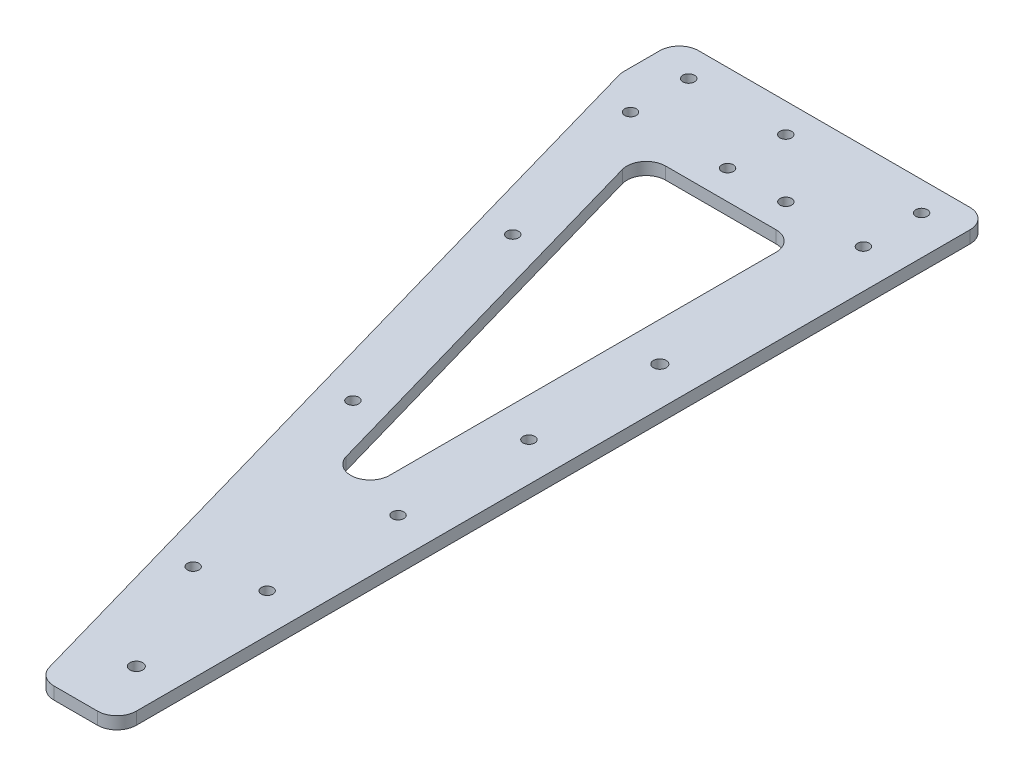
ISO-10303-21;
HEADER;
FILE_DESCRIPTION(('STEP AP214'),'2;1');
FILE_NAME('part.step','',(''),(''),'','','');
FILE_SCHEMA(('AUTOMOTIVE_DESIGN { 1 0 10303 214 1 1 1 1 }'));
ENDSEC;
DATA;
#1=APPLICATION_CONTEXT('core data for automotive mechanical design processes');
#2=APPLICATION_PROTOCOL_DEFINITION('international standard','automotive_design',2000,#1);
#3=PRODUCT_CONTEXT('',#1,'mechanical');
#4=PRODUCT('Part','Part','',(#3));
#5=PRODUCT_RELATED_PRODUCT_CATEGORY('part','',(#4));
#6=PRODUCT_DEFINITION_FORMATION('','',#4);
#7=PRODUCT_DEFINITION_CONTEXT('part definition',#1,'design');
#8=PRODUCT_DEFINITION('design','',#6,#7);
#9=PRODUCT_DEFINITION_SHAPE('','',#8);
#10=(LENGTH_UNIT() NAMED_UNIT(*) SI_UNIT(.MILLI.,.METRE.));
#11=(NAMED_UNIT(*) PLANE_ANGLE_UNIT() SI_UNIT($,.RADIAN.));
#12=(NAMED_UNIT(*) SI_UNIT($,.STERADIAN.) SOLID_ANGLE_UNIT());
#13=UNCERTAINTY_MEASURE_WITH_UNIT(LENGTH_MEASURE(1.E-05),#10,'distance_accuracy_value','');
#14=(GEOMETRIC_REPRESENTATION_CONTEXT(3) GLOBAL_UNCERTAINTY_ASSIGNED_CONTEXT((#13)) GLOBAL_UNIT_ASSIGNED_CONTEXT((#10,
#11,#12)) REPRESENTATION_CONTEXT('',''));
#15=CARTESIAN_POINT('',(0.,0.,0.));
#16=DIRECTION('',(0.,0.,1.));
#17=DIRECTION('',(1.,0.,0.));
#18=AXIS2_PLACEMENT_3D('',#15,#16,#17);
#19=CARTESIAN_POINT('',(-73.9622641509434,3.175,21.1320754716981));
#20=DIRECTION('',(-0.961523947640823,0.,0.274721127897378));
#21=DIRECTION('',(0.274721127897378,0.,0.961523947640823));
#22=AXIS2_PLACEMENT_3D('',#19,#20,#21);
#23=PLANE('',#22);
#24=DIRECTION('',(-0.274721127897378,0.,-0.961523947640823));
#25=VECTOR('',#24,1.);
#26=CARTESIAN_POINT('',(-73.9622641509434,0.,21.1320754716981));
#27=LINE('',#26,#25);
#28=CARTESIAN_POINT('',(-21.0361126744323,0.,206.373605639487));
#29=VERTEX_POINT('',#28);
#30=CARTESIAN_POINT('',(-79.8076197382041,0.,0.673330916285617));
#31=VERTEX_POINT('',#30);
#32=EDGE_CURVE('E187',#29,#31,#27,.T.);
#33=ORIENTED_EDGE('',*,*,#32,.F.);
#34=DIRECTION('',(0.,-1.,0.));
#35=VECTOR('',#34,1.);
#36=CARTESIAN_POINT('',(-21.0361126744323,3.175,206.373605639487));
#37=LINE('',#36,#35);
#38=CARTESIAN_POINT('',(-21.0361126744323,3.175,206.373605639487));
#39=VERTEX_POINT('',#38);
#40=EDGE_CURVE('E159',#29,#39,#37,.F.);
#41=ORIENTED_EDGE('',*,*,#40,.T.);
#42=DIRECTION('',(-0.274721127897378,0.,-0.961523947640823));
#43=VECTOR('',#42,1.);
#44=CARTESIAN_POINT('',(-73.9622641509434,3.175,21.1320754716981));
#45=LINE('',#44,#43);
#46=CARTESIAN_POINT('',(-79.8076197382041,3.175,0.673330916285617));
#47=VERTEX_POINT('',#46);
#48=EDGE_CURVE('E315',#39,#47,#45,.T.);
#49=ORIENTED_EDGE('',*,*,#48,.T.);
#50=DIRECTION('',(0.,-1.,0.));
#51=VECTOR('',#50,1.);
#52=CARTESIAN_POINT('',(-79.8076197382041,3.175,0.67333091628562));
#53=LINE('',#52,#51);
#54=EDGE_CURVE('E278',#47,#31,#53,.T.);
#55=ORIENTED_EDGE('',*,*,#54,.T.);
#56=EDGE_LOOP('',(#33,#41,#49,#55));
#57=FACE_BOUND('',#56,.T.);
#58=ADVANCED_FACE('F34',(#57),#23,.T.);
#59=CARTESIAN_POINT('',(0.,3.175,210.));
#60=DIRECTION('',(0.,0.,1.));
#61=DIRECTION('',(1.,0.,0.));
#62=AXIS2_PLACEMENT_3D('',#59,#60,#61);
#63=PLANE('',#62);
#64=DIRECTION('',(-1.,0.,0.));
#65=VECTOR('',#64,1.);
#66=CARTESIAN_POINT('',(0.,0.,210.));
#67=LINE('',#66,#65);
#68=CARTESIAN_POINT('',(-5.00000000000003,0.,210.));
#69=VERTEX_POINT('',#68);
#70=CARTESIAN_POINT('',(-16.2284929362282,0.,210.));
#71=VERTEX_POINT('',#70);
#72=EDGE_CURVE('E190',#69,#71,#67,.T.);
#73=ORIENTED_EDGE('',*,*,#72,.F.);
#74=DIRECTION('',(0.,-1.,0.));
#75=VECTOR('',#74,1.);
#76=CARTESIAN_POINT('',(-5.00000000000003,3.175,210.));
#77=LINE('',#76,#75);
#78=CARTESIAN_POINT('',(-5.00000000000003,3.175,210.));
#79=VERTEX_POINT('',#78);
#80=EDGE_CURVE('E276',#69,#79,#77,.F.);
#81=ORIENTED_EDGE('',*,*,#80,.T.);
#82=DIRECTION('',(-1.,0.,0.));
#83=VECTOR('',#82,1.);
#84=CARTESIAN_POINT('',(0.,3.175,210.));
#85=LINE('',#84,#83);
#86=CARTESIAN_POINT('',(-16.2284929362282,3.175,210.));
#87=VERTEX_POINT('',#86);
#88=EDGE_CURVE('E318',#79,#87,#85,.T.);
#89=ORIENTED_EDGE('',*,*,#88,.T.);
#90=DIRECTION('',(0.,-1.,0.));
#91=VECTOR('',#90,1.);
#92=CARTESIAN_POINT('',(-16.2284929362282,3.175,210.));
#93=LINE('',#92,#91);
#94=EDGE_CURVE('E273',#87,#71,#93,.T.);
#95=ORIENTED_EDGE('',*,*,#94,.T.);
#96=EDGE_LOOP('',(#73,#81,#89,#95));
#97=FACE_BOUND('',#96,.T.);
#98=ADVANCED_FACE('F426',(#97),#63,.T.);
#99=CARTESIAN_POINT('',(0.,3.175,0.));
#100=DIRECTION('',(1.,0.,0.));
#101=DIRECTION('',(0.,0.,-1.));
#102=AXIS2_PLACEMENT_3D('',#99,#100,#101);
#103=PLANE('',#102);
#104=DIRECTION('',(0.,0.,1.));
#105=VECTOR('',#104,1.);
#106=CARTESIAN_POINT('',(0.,0.,0.));
#107=LINE('',#106,#105);
#108=CARTESIAN_POINT('',(0.,0.,-9.99999999999998));
#109=VERTEX_POINT('',#108);
#110=CARTESIAN_POINT('',(0.,0.,205.));
#111=VERTEX_POINT('',#110);
#112=EDGE_CURVE('E193',#109,#111,#107,.T.);
#113=ORIENTED_EDGE('',*,*,#112,.F.);
#114=DIRECTION('',(0.,-1.,0.));
#115=VECTOR('',#114,1.);
#116=CARTESIAN_POINT('',(0.,3.175,-9.99999999999998));
#117=LINE('',#116,#115);
#118=CARTESIAN_POINT('',(0.,3.175,-9.99999999999998));
#119=VERTEX_POINT('',#118);
#120=EDGE_CURVE('E56',#109,#119,#117,.F.);
#121=ORIENTED_EDGE('',*,*,#120,.T.);
#122=DIRECTION('',(0.,0.,1.));
#123=VECTOR('',#122,1.);
#124=CARTESIAN_POINT('',(0.,3.175,0.));
#125=LINE('',#124,#123);
#126=CARTESIAN_POINT('',(0.,3.175,205.));
#127=VERTEX_POINT('',#126);
#128=EDGE_CURVE('E321',#119,#127,#125,.T.);
#129=ORIENTED_EDGE('',*,*,#128,.T.);
#130=DIRECTION('',(0.,-1.,0.));
#131=VECTOR('',#130,1.);
#132=CARTESIAN_POINT('',(0.,3.175,205.));
#133=LINE('',#132,#131);
#134=EDGE_CURVE('E269',#127,#111,#133,.T.);
#135=ORIENTED_EDGE('',*,*,#134,.T.);
#136=EDGE_LOOP('',(#113,#121,#129,#135));
#137=FACE_BOUND('',#136,.T.);
#138=ADVANCED_FACE('F431',(#137),#103,.T.);
#139=CARTESIAN_POINT('',(-20.,3.175,0.));
#140=DIRECTION('',(1.,0.,0.));
#141=DIRECTION('',(0.,0.,-1.));
#142=AXIS2_PLACEMENT_3D('',#139,#140,#141);
#143=PLANE('',#142);
#144=DIRECTION('',(0.,0.,1.));
#145=VECTOR('',#144,1.);
#146=CARTESIAN_POINT('',(-20.,0.,0.));
#147=LINE('',#146,#145);
#148=CARTESIAN_POINT('',(-20.,0.,20.));
#149=VERTEX_POINT('',#148);
#150=CARTESIAN_POINT('',(-20.,0.,119.698901107195));
#151=VERTEX_POINT('',#150);
#152=EDGE_CURVE('E176',#149,#151,#147,.T.);
#153=ORIENTED_EDGE('',*,*,#152,.T.);
#154=DIRECTION('',(0.,-1.,0.));
#155=VECTOR('',#154,1.);
#156=CARTESIAN_POINT('',(-20.,3.175,119.698901107195));
#157=LINE('',#156,#155);
#158=CARTESIAN_POINT('',(-20.,3.175,119.698901107195));
#159=VERTEX_POINT('',#158);
#160=EDGE_CURVE('E153',#151,#159,#157,.F.);
#161=ORIENTED_EDGE('',*,*,#160,.T.);
#162=DIRECTION('',(0.,0.,1.));
#163=VECTOR('',#162,1.);
#164=CARTESIAN_POINT('',(-20.,3.175,0.));
#165=LINE('',#164,#163);
#166=CARTESIAN_POINT('',(-20.,3.175,20.));
#167=VERTEX_POINT('',#166);
#168=EDGE_CURVE('E229',#167,#159,#165,.T.);
#169=ORIENTED_EDGE('',*,*,#168,.F.);
#170=DIRECTION('',(0.,-1.,0.));
#171=VECTOR('',#170,1.);
#172=CARTESIAN_POINT('',(-20.,0.,20.));
#173=LINE('',#172,#171);
#174=EDGE_CURVE('E169',#167,#149,#173,.T.);
#175=ORIENTED_EDGE('',*,*,#174,.T.);
#176=EDGE_LOOP('',(#153,#161,#169,#175));
#177=FACE_BOUND('',#176,.T.);
#178=ADVANCED_FACE('F299',(#177),#143,.F.);
#179=CARTESIAN_POINT('',(-59.5394049363311,3.175,17.0112585532375));
#180=DIRECTION('',(-0.961523947640823,0.,0.274721127897378));
#181=DIRECTION('',(0.274721127897378,0.,0.961523947640823));
#182=AXIS2_PLACEMENT_3D('',#179,#180,#181);
#183=PLANE('',#182);
#184=DIRECTION('',(-0.274721127897378,0.,-0.961523947640823));
#185=VECTOR('',#184,1.);
#186=CARTESIAN_POINT('',(-59.5394049363311,3.175,17.0112585532375));
#187=LINE('',#186,#185);
#188=CARTESIAN_POINT('',(-29.8076197382041,3.175,121.072506746682));
#189=VERTEX_POINT('',#188);
#190=CARTESIAN_POINT('',(-58.2930200545455,3.175,21.3736056394869));
#191=VERTEX_POINT('',#190);
#192=EDGE_CURVE('E168',#189,#191,#187,.T.);
#193=ORIENTED_EDGE('',*,*,#192,.F.);
#194=DIRECTION('',(0.,-1.,0.));
#195=VECTOR('',#194,1.);
#196=CARTESIAN_POINT('',(-29.8076197382041,0.,121.072506746682));
#197=LINE('',#196,#195);
#198=CARTESIAN_POINT('',(-29.8076197382041,0.,121.072506746682));
#199=VERTEX_POINT('',#198);
#200=EDGE_CURVE('E152',#189,#199,#197,.T.);
#201=ORIENTED_EDGE('',*,*,#200,.T.);
#202=DIRECTION('',(-0.274721127897378,0.,-0.961523947640823));
#203=VECTOR('',#202,1.);
#204=CARTESIAN_POINT('',(-59.5394049363311,0.,17.0112585532375));
#205=LINE('',#204,#203);
#206=CARTESIAN_POINT('',(-58.2930200545455,0.,21.3736056394869));
#207=VERTEX_POINT('',#206);
#208=EDGE_CURVE('E165',#199,#207,#205,.T.);
#209=ORIENTED_EDGE('',*,*,#208,.T.);
#210=DIRECTION('',(0.,-1.,0.));
#211=VECTOR('',#210,1.);
#212=CARTESIAN_POINT('',(-58.2930200545455,3.175,21.3736056394869));
#213=LINE('',#212,#211);
#214=EDGE_CURVE('E170',#207,#191,#213,.F.);
#215=ORIENTED_EDGE('',*,*,#214,.T.);
#216=EDGE_LOOP('',(#193,#201,#209,#215));
#217=FACE_BOUND('',#216,.T.);
#218=ADVANCED_FACE('F164',(#217),#183,.F.);
#219=CARTESIAN_POINT('',(-10.,3.175,60.));
#220=DIRECTION('',(0.,-1.,0.));
#221=DIRECTION('',(0.,0.,-1.));
#222=AXIS2_PLACEMENT_3D('',#219,#220,#221);
#223=CYLINDRICAL_SURFACE('',#222,1.65);
#224=CARTESIAN_POINT('',(-10.,3.175,60.));
#225=DIRECTION('',(0.,1.,0.));
#226=DIRECTION('',(0.,0.,1.));
#227=AXIS2_PLACEMENT_3D('',#224,#225,#226);
#228=CIRCLE('',#227,1.65);
#229=CARTESIAN_POINT('',(-10.,3.175,61.65));
#230=VERTEX_POINT('',#229);
#231=EDGE_CURVE('E350',#230,#230,#228,.T.);
#232=ORIENTED_EDGE('',*,*,#231,.T.);
#233=EDGE_LOOP('',(#232));
#234=FACE_BOUND('',#233,.T.);
#235=CARTESIAN_POINT('',(-10.,0.,60.));
#236=DIRECTION('',(0.,1.,0.));
#237=DIRECTION('',(0.,0.,1.));
#238=AXIS2_PLACEMENT_3D('',#235,#236,#237);
#239=CIRCLE('',#238,1.65);
#240=CARTESIAN_POINT('',(-10.,0.,61.65));
#241=VERTEX_POINT('',#240);
#242=EDGE_CURVE('E223',#241,#241,#239,.T.);
#243=ORIENTED_EDGE('',*,*,#242,.F.);
#244=EDGE_LOOP('',(#243));
#245=FACE_BOUND('',#244,.T.);
#246=ADVANCED_FACE('F460',(#234,#245),#223,.F.);
#247=CARTESIAN_POINT('',(-10.,3.175,161.25));
#248=DIRECTION('',(0.,-1.,0.));
#249=DIRECTION('',(0.,0.,-1.));
#250=AXIS2_PLACEMENT_3D('',#247,#248,#249);
#251=CYLINDRICAL_SURFACE('',#250,1.5);
#252=CARTESIAN_POINT('',(-10.,3.175,161.25));
#253=DIRECTION('',(0.,1.,0.));
#254=DIRECTION('',(0.,0.,1.));
#255=AXIS2_PLACEMENT_3D('',#252,#253,#254);
#256=CIRCLE('',#255,1.5);
#257=CARTESIAN_POINT('',(-10.,3.175,162.75));
#258=VERTEX_POINT('',#257);
#259=EDGE_CURVE('E347',#258,#258,#256,.T.);
#260=ORIENTED_EDGE('',*,*,#259,.T.);
#261=EDGE_LOOP('',(#260));
#262=FACE_BOUND('',#261,.T.);
#263=CARTESIAN_POINT('',(-10.,0.,161.25));
#264=DIRECTION('',(0.,1.,0.));
#265=DIRECTION('',(0.,0.,1.));
#266=AXIS2_PLACEMENT_3D('',#263,#264,#265);
#267=CIRCLE('',#266,1.5);
#268=CARTESIAN_POINT('',(-10.,0.,162.75));
#269=VERTEX_POINT('',#268);
#270=EDGE_CURVE('E220',#269,#269,#267,.T.);
#271=ORIENTED_EDGE('',*,*,#270,.F.);
#272=EDGE_LOOP('',(#271));
#273=FACE_BOUND('',#272,.T.);
#274=ADVANCED_FACE('F707',(#262,#273),#251,.F.);
#275=CARTESIAN_POINT('',(-10.,3.175,127.5));
#276=DIRECTION('',(0.,-1.,0.));
#277=DIRECTION('',(0.,0.,-1.));
#278=AXIS2_PLACEMENT_3D('',#275,#276,#277);
#279=CYLINDRICAL_SURFACE('',#278,1.5);
#280=CARTESIAN_POINT('',(-10.,3.175,127.5));
#281=DIRECTION('',(0.,1.,0.));
#282=DIRECTION('',(0.,0.,1.));
#283=AXIS2_PLACEMENT_3D('',#280,#281,#282);
#284=CIRCLE('',#283,1.5);
#285=CARTESIAN_POINT('',(-10.,3.175,129.));
#286=VERTEX_POINT('',#285);
#287=EDGE_CURVE('E344',#286,#286,#284,.T.);
#288=ORIENTED_EDGE('',*,*,#287,.T.);
#289=EDGE_LOOP('',(#288));
#290=FACE_BOUND('',#289,.T.);
#291=CARTESIAN_POINT('',(-10.,0.,127.5));
#292=DIRECTION('',(0.,1.,0.));
#293=DIRECTION('',(0.,0.,1.));
#294=AXIS2_PLACEMENT_3D('',#291,#292,#293);
#295=CIRCLE('',#294,1.5);
#296=CARTESIAN_POINT('',(-10.,0.,129.));
#297=VERTEX_POINT('',#296);
#298=EDGE_CURVE('E217',#297,#297,#295,.T.);
#299=ORIENTED_EDGE('',*,*,#298,.F.);
#300=EDGE_LOOP('',(#299));
#301=FACE_BOUND('',#300,.T.);
#302=ADVANCED_FACE('F697',(#290,#301),#279,.F.);
#303=CARTESIAN_POINT('',(-10.,3.175,93.75));
#304=DIRECTION('',(0.,-1.,0.));
#305=DIRECTION('',(0.,0.,-1.));
#306=AXIS2_PLACEMENT_3D('',#303,#304,#305);
#307=CYLINDRICAL_SURFACE('',#306,1.5);
#308=CARTESIAN_POINT('',(-10.,3.175,93.75));
#309=DIRECTION('',(0.,1.,0.));
#310=DIRECTION('',(0.,0.,1.));
#311=AXIS2_PLACEMENT_3D('',#308,#309,#310);
#312=CIRCLE('',#311,1.5);
#313=CARTESIAN_POINT('',(-10.,3.175,95.25));
#314=VERTEX_POINT('',#313);
#315=EDGE_CURVE('E341',#314,#314,#312,.T.);
#316=ORIENTED_EDGE('',*,*,#315,.T.);
#317=EDGE_LOOP('',(#316));
#318=FACE_BOUND('',#317,.T.);
#319=CARTESIAN_POINT('',(-10.,0.,93.75));
#320=DIRECTION('',(0.,1.,0.));
#321=DIRECTION('',(0.,0.,1.));
#322=AXIS2_PLACEMENT_3D('',#319,#320,#321);
#323=CIRCLE('',#322,1.5);
#324=CARTESIAN_POINT('',(-10.,0.,95.25));
#325=VERTEX_POINT('',#324);
#326=EDGE_CURVE('E214',#325,#325,#323,.T.);
#327=ORIENTED_EDGE('',*,*,#326,.F.);
#328=EDGE_LOOP('',(#327));
#329=FACE_BOUND('',#328,.T.);
#330=ADVANCED_FACE('F687',(#318,#329),#307,.F.);
#331=CARTESIAN_POINT('',(-24.9395300818182,3.175,165.411232628834));
#332=DIRECTION('',(0.,-1.,0.));
#333=DIRECTION('',(0.,0.,-1.));
#334=AXIS2_PLACEMENT_3D('',#331,#332,#333);
#335=CYLINDRICAL_SURFACE('',#334,1.5);
#336=CARTESIAN_POINT('',(-24.9395300818182,3.175,165.411232628834));
#337=DIRECTION('',(0.,1.,0.));
#338=DIRECTION('',(0.,0.,1.));
#339=AXIS2_PLACEMENT_3D('',#336,#337,#338);
#340=CIRCLE('',#339,1.5);
#341=CARTESIAN_POINT('',(-24.9395300818182,3.175,166.911232628834));
#342=VERTEX_POINT('',#341);
#343=EDGE_CURVE('E338',#342,#342,#340,.T.);
#344=ORIENTED_EDGE('',*,*,#343,.T.);
#345=EDGE_LOOP('',(#344));
#346=FACE_BOUND('',#345,.T.);
#347=CARTESIAN_POINT('',(-24.9395300818182,0.,165.411232628834));
#348=DIRECTION('',(0.,1.,0.));
#349=DIRECTION('',(0.,0.,1.));
#350=AXIS2_PLACEMENT_3D('',#347,#348,#349);
#351=CIRCLE('',#350,1.5);
#352=CARTESIAN_POINT('',(-24.9395300818182,0.,166.911232628834));
#353=VERTEX_POINT('',#352);
#354=EDGE_CURVE('E211',#353,#353,#351,.T.);
#355=ORIENTED_EDGE('',*,*,#354,.F.);
#356=EDGE_LOOP('',(#355));
#357=FACE_BOUND('',#356,.T.);
#358=ADVANCED_FACE('F677',(#346,#357),#335,.F.);
#359=CARTESIAN_POINT('',(-41.4227977556609,3.175,107.719795770385));
#360=DIRECTION('',(0.,-1.,0.));
#361=DIRECTION('',(0.,0.,-1.));
#362=AXIS2_PLACEMENT_3D('',#359,#360,#361);
#363=CYLINDRICAL_SURFACE('',#362,1.5);
#364=CARTESIAN_POINT('',(-41.4227977556609,3.175,107.719795770385));
#365=DIRECTION('',(0.,1.,0.));
#366=DIRECTION('',(0.,0.,1.));
#367=AXIS2_PLACEMENT_3D('',#364,#365,#366);
#368=CIRCLE('',#367,1.5);
#369=CARTESIAN_POINT('',(-41.4227977556609,3.175,109.219795770385));
#370=VERTEX_POINT('',#369);
#371=EDGE_CURVE('E335',#370,#370,#368,.T.);
#372=ORIENTED_EDGE('',*,*,#371,.T.);
#373=EDGE_LOOP('',(#372));
#374=FACE_BOUND('',#373,.T.);
#375=CARTESIAN_POINT('',(-41.4227977556609,0.,107.719795770385));
#376=DIRECTION('',(0.,1.,0.));
#377=DIRECTION('',(0.,0.,1.));
#378=AXIS2_PLACEMENT_3D('',#375,#376,#377);
#379=CIRCLE('',#378,1.5);
#380=CARTESIAN_POINT('',(-41.4227977556609,0.,109.219795770385));
#381=VERTEX_POINT('',#380);
#382=EDGE_CURVE('E208',#381,#381,#379,.T.);
#383=ORIENTED_EDGE('',*,*,#382,.F.);
#384=EDGE_LOOP('',(#383));
#385=FACE_BOUND('',#384,.T.);
#386=ADVANCED_FACE('F667',(#374,#385),#363,.F.);
#387=CARTESIAN_POINT('',(-57.9060654295036,3.175,50.0283589119354));
#388=DIRECTION('',(0.,-1.,0.));
#389=DIRECTION('',(0.,0.,-1.));
#390=AXIS2_PLACEMENT_3D('',#387,#388,#389);
#391=CYLINDRICAL_SURFACE('',#390,1.5);
#392=CARTESIAN_POINT('',(-57.9060654295036,3.175,50.0283589119354));
#393=DIRECTION('',(0.,1.,0.));
#394=DIRECTION('',(0.,0.,1.));
#395=AXIS2_PLACEMENT_3D('',#392,#393,#394);
#396=CIRCLE('',#395,1.5);
#397=CARTESIAN_POINT('',(-57.9060654295036,3.175,51.5283589119354));
#398=VERTEX_POINT('',#397);
#399=EDGE_CURVE('E332',#398,#398,#396,.T.);
#400=ORIENTED_EDGE('',*,*,#399,.T.);
#401=EDGE_LOOP('',(#400));
#402=FACE_BOUND('',#401,.T.);
#403=CARTESIAN_POINT('',(-57.9060654295036,0.,50.0283589119354));
#404=DIRECTION('',(0.,1.,0.));
#405=DIRECTION('',(0.,0.,1.));
#406=AXIS2_PLACEMENT_3D('',#403,#404,#405);
#407=CIRCLE('',#406,1.5);
#408=CARTESIAN_POINT('',(-57.9060654295036,0.,51.5283589119354));
#409=VERTEX_POINT('',#408);
#410=EDGE_CURVE('E205',#409,#409,#407,.T.);
#411=ORIENTED_EDGE('',*,*,#410,.F.);
#412=EDGE_LOOP('',(#411));
#413=FACE_BOUND('',#412,.T.);
#414=ADVANCED_FACE('F657',(#402,#413),#391,.F.);
#415=CARTESIAN_POINT('',(-70.057025118628,3.175,7.50000000000001));
#416=DIRECTION('',(0.,-1.,0.));
#417=DIRECTION('',(0.,0.,-1.));
#418=AXIS2_PLACEMENT_3D('',#415,#416,#417);
#419=CYLINDRICAL_SURFACE('',#418,1.5);
#420=CARTESIAN_POINT('',(-70.057025118628,3.175,7.50000000000001));
#421=DIRECTION('',(0.,1.,0.));
#422=DIRECTION('',(0.,0.,1.));
#423=AXIS2_PLACEMENT_3D('',#420,#421,#422);
#424=CIRCLE('',#423,1.5);
#425=CARTESIAN_POINT('',(-70.057025118628,3.175,9.00000000000001));
#426=VERTEX_POINT('',#425);
#427=EDGE_CURVE('E329',#426,#426,#424,.T.);
#428=ORIENTED_EDGE('',*,*,#427,.T.);
#429=EDGE_LOOP('',(#428));
#430=FACE_BOUND('',#429,.T.);
#431=CARTESIAN_POINT('',(-70.057025118628,0.,7.50000000000001));
#432=DIRECTION('',(0.,1.,0.));
#433=DIRECTION('',(0.,0.,1.));
#434=AXIS2_PLACEMENT_3D('',#431,#432,#433);
#435=CIRCLE('',#434,1.5);
#436=CARTESIAN_POINT('',(-70.057025118628,0.,9.00000000000001));
#437=VERTEX_POINT('',#436);
#438=EDGE_CURVE('E202',#437,#437,#435,.T.);
#439=ORIENTED_EDGE('',*,*,#438,.F.);
#440=EDGE_LOOP('',(#439));
#441=FACE_BOUND('',#440,.T.);
#442=ADVANCED_FACE('F647',(#430,#441),#419,.F.);
#443=CARTESIAN_POINT('',(-45.028512559314,3.175,7.50000000000001));
#444=DIRECTION('',(0.,-1.,0.));
#445=DIRECTION('',(0.,0.,-1.));
#446=AXIS2_PLACEMENT_3D('',#443,#444,#445);
#447=CYLINDRICAL_SURFACE('',#446,1.5);
#448=CARTESIAN_POINT('',(-45.028512559314,3.175,7.50000000000001));
#449=DIRECTION('',(0.,1.,0.));
#450=DIRECTION('',(0.,0.,1.));
#451=AXIS2_PLACEMENT_3D('',#448,#449,#450);
#452=CIRCLE('',#451,1.5);
#453=CARTESIAN_POINT('',(-45.028512559314,3.175,9.00000000000001));
#454=VERTEX_POINT('',#453);
#455=EDGE_CURVE('E326',#454,#454,#452,.T.);
#456=ORIENTED_EDGE('',*,*,#455,.T.);
#457=EDGE_LOOP('',(#456));
#458=FACE_BOUND('',#457,.T.);
#459=CARTESIAN_POINT('',(-45.028512559314,0.,7.50000000000001));
#460=DIRECTION('',(0.,1.,0.));
#461=DIRECTION('',(0.,0.,1.));
#462=AXIS2_PLACEMENT_3D('',#459,#460,#461);
#463=CIRCLE('',#462,1.5);
#464=CARTESIAN_POINT('',(-45.028512559314,0.,9.00000000000001));
#465=VERTEX_POINT('',#464);
#466=EDGE_CURVE('E199',#465,#465,#463,.T.);
#467=ORIENTED_EDGE('',*,*,#466,.F.);
#468=EDGE_LOOP('',(#467));
#469=FACE_BOUND('',#468,.T.);
#470=ADVANCED_FACE('F637',(#458,#469),#447,.F.);
#471=CARTESIAN_POINT('',(-30.,3.175,7.50000000000002));
#472=DIRECTION('',(0.,-1.,0.));
#473=DIRECTION('',(0.,0.,-1.));
#474=AXIS2_PLACEMENT_3D('',#471,#472,#473);
#475=CYLINDRICAL_SURFACE('',#474,1.5);
#476=CARTESIAN_POINT('',(-30.,3.175,7.50000000000002));
#477=DIRECTION('',(0.,1.,0.));
#478=DIRECTION('',(0.,0.,1.));
#479=AXIS2_PLACEMENT_3D('',#476,#477,#478);
#480=CIRCLE('',#479,1.5);
#481=CARTESIAN_POINT('',(-30.,3.175,9.00000000000002));
#482=VERTEX_POINT('',#481);
#483=EDGE_CURVE('E323',#482,#482,#480,.T.);
#484=ORIENTED_EDGE('',*,*,#483,.T.);
#485=EDGE_LOOP('',(#484));
#486=FACE_BOUND('',#485,.T.);
#487=CARTESIAN_POINT('',(-30.,0.,7.50000000000002));
#488=DIRECTION('',(0.,1.,0.));
#489=DIRECTION('',(0.,0.,1.));
#490=AXIS2_PLACEMENT_3D('',#487,#488,#489);
#491=CIRCLE('',#490,1.5);
#492=CARTESIAN_POINT('',(-30.,0.,9.00000000000002));
#493=VERTEX_POINT('',#492);
#494=EDGE_CURVE('E196',#493,#493,#491,.T.);
#495=ORIENTED_EDGE('',*,*,#494,.F.);
#496=EDGE_LOOP('',(#495));
#497=FACE_BOUND('',#496,.T.);
#498=ADVANCED_FACE('F454',(#486,#497),#475,.F.);
#499=CARTESIAN_POINT('',(-10.,3.175,195.));
#500=DIRECTION('',(0.,-1.,0.));
#501=DIRECTION('',(0.,0.,-1.));
#502=AXIS2_PLACEMENT_3D('',#499,#500,#501);
#503=CYLINDRICAL_SURFACE('',#502,1.65000000000001);
#504=CARTESIAN_POINT('',(-10.,3.175,195.));
#505=DIRECTION('',(0.,1.,0.));
#506=DIRECTION('',(0.,0.,1.));
#507=AXIS2_PLACEMENT_3D('',#504,#505,#506);
#508=CIRCLE('',#507,1.65000000000001);
#509=CARTESIAN_POINT('',(-10.,3.175,196.65));
#510=VERTEX_POINT('',#509);
#511=EDGE_CURVE('E309',#510,#510,#508,.T.);
#512=ORIENTED_EDGE('',*,*,#511,.T.);
#513=EDGE_LOOP('',(#512));
#514=FACE_BOUND('',#513,.T.);
#515=CARTESIAN_POINT('',(-10.,0.,195.));
#516=DIRECTION('',(0.,1.,0.));
#517=DIRECTION('',(0.,0.,1.));
#518=AXIS2_PLACEMENT_3D('',#515,#516,#517);
#519=CIRCLE('',#518,1.65000000000001);
#520=CARTESIAN_POINT('',(-10.,0.,196.65));
#521=VERTEX_POINT('',#520);
#522=EDGE_CURVE('E179',#521,#521,#519,.T.);
#523=ORIENTED_EDGE('',*,*,#522,.F.);
#524=EDGE_LOOP('',(#523));
#525=FACE_BOUND('',#524,.T.);
#526=ADVANCED_FACE('F451',(#514,#525),#503,.F.);
#527=CARTESIAN_POINT('',(0.,3.175,15.));
#528=DIRECTION('',(0.,0.,-1.));
#529=DIRECTION('',(-1.,0.,0.));
#530=AXIS2_PLACEMENT_3D('',#527,#528,#529);
#531=PLANE('',#530);
#532=DIRECTION('',(1.,0.,0.));
#533=VECTOR('',#532,1.);
#534=CARTESIAN_POINT('',(0.,0.,15.));
#535=LINE('',#534,#533);
#536=CARTESIAN_POINT('',(-53.4854003163414,0.,15.));
#537=VERTEX_POINT('',#536);
#538=CARTESIAN_POINT('',(-25.,0.,15.));
#539=VERTEX_POINT('',#538);
#540=EDGE_CURVE('E175',#537,#539,#535,.T.);
#541=ORIENTED_EDGE('',*,*,#540,.T.);
#542=DIRECTION('',(0.,-1.,0.));
#543=VECTOR('',#542,1.);
#544=CARTESIAN_POINT('',(-25.,3.175,15.));
#545=LINE('',#544,#543);
#546=CARTESIAN_POINT('',(-25.,3.175,15.));
#547=VERTEX_POINT('',#546);
#548=EDGE_CURVE('E238',#539,#547,#545,.F.);
#549=ORIENTED_EDGE('',*,*,#548,.T.);
#550=DIRECTION('',(1.,0.,0.));
#551=VECTOR('',#550,1.);
#552=CARTESIAN_POINT('',(0.,3.175,15.));
#553=LINE('',#552,#551);
#554=CARTESIAN_POINT('',(-53.4854003163414,3.175,15.));
#555=VERTEX_POINT('',#554);
#556=EDGE_CURVE('E294',#555,#547,#553,.T.);
#557=ORIENTED_EDGE('',*,*,#556,.F.);
#558=DIRECTION('',(0.,-1.,0.));
#559=VECTOR('',#558,1.);
#560=CARTESIAN_POINT('',(-53.4854003163414,0.,15.));
#561=LINE('',#560,#559);
#562=EDGE_CURVE('E235',#555,#537,#561,.T.);
#563=ORIENTED_EDGE('',*,*,#562,.T.);
#564=EDGE_LOOP('',(#541,#549,#557,#563));
#565=FACE_BOUND('',#564,.T.);
#566=ADVANCED_FACE('F303',(#565),#531,.F.);
#567=CARTESIAN_POINT('',(-9.99999999999997,3.175,7.50000000000002));
#568=DIRECTION('',(0.,-1.,0.));
#569=DIRECTION('',(0.,0.,-1.));
#570=AXIS2_PLACEMENT_3D('',#567,#568,#569);
#571=CYLINDRICAL_SURFACE('',#570,1.5);
#572=CARTESIAN_POINT('',(-9.99999999999997,3.175,7.50000000000002));
#573=DIRECTION('',(0.,1.,0.));
#574=DIRECTION('',(0.,0.,1.));
#575=AXIS2_PLACEMENT_3D('',#572,#573,#574);
#576=CIRCLE('',#575,1.5);
#577=CARTESIAN_POINT('',(-9.99999999999997,3.175,9.00000000000002));
#578=VERTEX_POINT('',#577);
#579=EDGE_CURVE('E230',#578,#578,#576,.T.);
#580=ORIENTED_EDGE('',*,*,#579,.T.);
#581=EDGE_LOOP('',(#580));
#582=FACE_BOUND('',#581,.T.);
#583=CARTESIAN_POINT('',(-9.99999999999997,0.,7.50000000000002));
#584=DIRECTION('',(0.,1.,0.));
#585=DIRECTION('',(0.,0.,1.));
#586=AXIS2_PLACEMENT_3D('',#583,#584,#585);
#587=CIRCLE('',#586,1.5);
#588=CARTESIAN_POINT('',(-9.99999999999997,0.,9.00000000000002));
#589=VERTEX_POINT('',#588);
#590=EDGE_CURVE('E226',#589,#589,#587,.T.);
#591=ORIENTED_EDGE('',*,*,#590,.F.);
#592=EDGE_LOOP('',(#591));
#593=FACE_BOUND('',#592,.T.);
#594=ADVANCED_FACE('F355',(#582,#593),#571,.F.);
#595=CARTESIAN_POINT('',(0.,3.175,0.));
#596=DIRECTION('',(0.,1.,0.));
#597=DIRECTION('',(0.,0.,1.));
#598=AXIS2_PLACEMENT_3D('',#595,#596,#597);
#599=PLANE('',#598);
#600=ORIENTED_EDGE('',*,*,#556,.T.);
#601=CARTESIAN_POINT('',(-25.,3.175,20.));
#602=DIRECTION('',(0.,1.,0.));
#603=DIRECTION('',(0.,0.,1.));
#604=AXIS2_PLACEMENT_3D('',#601,#602,#603);
#605=CIRCLE('',#604,5.);
#606=EDGE_CURVE('E285',#547,#167,#605,.F.);
#607=ORIENTED_EDGE('',*,*,#606,.T.);
#608=ORIENTED_EDGE('',*,*,#168,.T.);
#609=CARTESIAN_POINT('',(-25.,3.175,119.698901107195));
#610=DIRECTION('',(0.,1.,0.));
#611=DIRECTION('',(0.,0.,1.));
#612=AXIS2_PLACEMENT_3D('',#609,#610,#611);
#613=CIRCLE('',#612,5.);
#614=EDGE_CURVE('E158',#159,#189,#613,.F.);
#615=ORIENTED_EDGE('',*,*,#614,.T.);
#616=ORIENTED_EDGE('',*,*,#192,.T.);
#617=CARTESIAN_POINT('',(-53.4854003163414,3.175,20.));
#618=DIRECTION('',(0.,1.,0.));
#619=DIRECTION('',(0.,0.,1.));
#620=AXIS2_PLACEMENT_3D('',#617,#618,#619);
#621=CIRCLE('',#620,5.);
#622=EDGE_CURVE('E11',#191,#555,#621,.F.);
#623=ORIENTED_EDGE('',*,*,#622,.T.);
#624=EDGE_LOOP('',(#600,#607,#608,#615,#616,#623));
#625=FACE_BOUND('',#624,.T.);
#626=ORIENTED_EDGE('',*,*,#511,.F.);
#627=EDGE_LOOP('',(#626));
#628=FACE_BOUND('',#627,.T.);
#629=DIRECTION('',(1.,0.,0.));
#630=VECTOR('',#629,1.);
#631=CARTESIAN_POINT('',(0.,3.175,-15.));
#632=LINE('',#631,#630);
#633=CARTESIAN_POINT('',(-75.,3.175,-15.));
#634=VERTEX_POINT('',#633);
#635=CARTESIAN_POINT('',(-5.,3.175,-15.));
#636=VERTEX_POINT('',#635);
#637=EDGE_CURVE('E181',#634,#636,#632,.T.);
#638=ORIENTED_EDGE('',*,*,#637,.F.);
#639=CARTESIAN_POINT('',(-75.,3.175,-9.99999999999998));
#640=DIRECTION('',(0.,1.,0.));
#641=DIRECTION('',(0.,0.,1.));
#642=AXIS2_PLACEMENT_3D('',#639,#640,#641);
#643=CIRCLE('',#642,5.);
#644=CARTESIAN_POINT('',(-80.,3.175,-9.99999999999998));
#645=VERTEX_POINT('',#644);
#646=EDGE_CURVE('E267',#634,#645,#643,.T.);
#647=ORIENTED_EDGE('',*,*,#646,.T.);
#648=DIRECTION('',(0.,0.,-1.));
#649=VECTOR('',#648,1.);
#650=CARTESIAN_POINT('',(-80.,3.175,0.));
#651=LINE('',#650,#649);
#652=CARTESIAN_POINT('',(-80.,3.175,-0.700274723201277));
#653=VERTEX_POINT('',#652);
#654=EDGE_CURVE('E373',#653,#645,#651,.T.);
#655=ORIENTED_EDGE('',*,*,#654,.F.);
#656=CARTESIAN_POINT('',(-75.,3.175,-0.700274723201277));
#657=DIRECTION('',(0.,1.,0.));
#658=DIRECTION('',(0.,0.,1.));
#659=AXIS2_PLACEMENT_3D('',#656,#657,#658);
#660=CIRCLE('',#659,5.);
#661=EDGE_CURVE('E260',#653,#47,#660,.T.);
#662=ORIENTED_EDGE('',*,*,#661,.T.);
#663=ORIENTED_EDGE('',*,*,#48,.F.);
#664=CARTESIAN_POINT('',(-16.2284929362282,3.175,205.));
#665=DIRECTION('',(0.,1.,0.));
#666=DIRECTION('',(0.,0.,1.));
#667=AXIS2_PLACEMENT_3D('',#664,#665,#666);
#668=CIRCLE('',#667,5.);
#669=EDGE_CURVE('E262',#39,#87,#668,.T.);
#670=ORIENTED_EDGE('',*,*,#669,.T.);
#671=ORIENTED_EDGE('',*,*,#88,.F.);
#672=CARTESIAN_POINT('',(-5.00000000000003,3.175,205.));
#673=DIRECTION('',(0.,1.,0.));
#674=DIRECTION('',(0.,0.,1.));
#675=AXIS2_PLACEMENT_3D('',#672,#673,#674);
#676=CIRCLE('',#675,5.);
#677=EDGE_CURVE('E49',#79,#127,#676,.T.);
#678=ORIENTED_EDGE('',*,*,#677,.T.);
#679=ORIENTED_EDGE('',*,*,#128,.F.);
#680=CARTESIAN_POINT('',(-5.,3.175,-9.99999999999998));
#681=DIRECTION('',(0.,1.,0.));
#682=DIRECTION('',(0.,0.,1.));
#683=AXIS2_PLACEMENT_3D('',#680,#681,#682);
#684=CIRCLE('',#683,5.);
#685=EDGE_CURVE('E265',#119,#636,#684,.T.);
#686=ORIENTED_EDGE('',*,*,#685,.T.);
#687=EDGE_LOOP('',(#638,#647,#655,#662,#663,#670,#671,#678,#679,#686));
#688=FACE_BOUND('',#687,.T.);
#689=ORIENTED_EDGE('',*,*,#483,.F.);
#690=EDGE_LOOP('',(#689));
#691=FACE_BOUND('',#690,.T.);
#692=ORIENTED_EDGE('',*,*,#455,.F.);
#693=EDGE_LOOP('',(#692));
#694=FACE_BOUND('',#693,.T.);
#695=ORIENTED_EDGE('',*,*,#427,.F.);
#696=EDGE_LOOP('',(#695));
#697=FACE_BOUND('',#696,.T.);
#698=ORIENTED_EDGE('',*,*,#399,.F.);
#699=EDGE_LOOP('',(#698));
#700=FACE_BOUND('',#699,.T.);
#701=ORIENTED_EDGE('',*,*,#371,.F.);
#702=EDGE_LOOP('',(#701));
#703=FACE_BOUND('',#702,.T.);
#704=ORIENTED_EDGE('',*,*,#343,.F.);
#705=EDGE_LOOP('',(#704));
#706=FACE_BOUND('',#705,.T.);
#707=ORIENTED_EDGE('',*,*,#315,.F.);
#708=EDGE_LOOP('',(#707));
#709=FACE_BOUND('',#708,.T.);
#710=ORIENTED_EDGE('',*,*,#287,.F.);
#711=EDGE_LOOP('',(#710));
#712=FACE_BOUND('',#711,.T.);
#713=ORIENTED_EDGE('',*,*,#259,.F.);
#714=EDGE_LOOP('',(#713));
#715=FACE_BOUND('',#714,.T.);
#716=ORIENTED_EDGE('',*,*,#231,.F.);
#717=EDGE_LOOP('',(#716));
#718=FACE_BOUND('',#717,.T.);
#719=ORIENTED_EDGE('',*,*,#579,.F.);
#720=EDGE_LOOP('',(#719));
#721=FACE_BOUND('',#720,.T.);
#722=CARTESIAN_POINT('',(-9.99999999999997,3.175,-7.49999999999998));
#723=DIRECTION('',(0.,-1.,0.));
#724=DIRECTION('',(0.,0.,-1.));
#725=AXIS2_PLACEMENT_3D('',#722,#723,#724);
#726=CIRCLE('',#725,1.5);
#727=CARTESIAN_POINT('',(-9.99999999999997,3.175,-8.99999999999998));
#728=VERTEX_POINT('',#727);
#729=EDGE_CURVE('E364',#728,#728,#726,.T.);
#730=ORIENTED_EDGE('',*,*,#729,.T.);
#731=EDGE_LOOP('',(#730));
#732=FACE_BOUND('',#731,.T.);
#733=CARTESIAN_POINT('',(-45.028512559314,3.175,-7.49999999999999));
#734=DIRECTION('',(0.,-1.,0.));
#735=DIRECTION('',(0.,0.,-1.));
#736=AXIS2_PLACEMENT_3D('',#733,#734,#735);
#737=CIRCLE('',#736,1.5);
#738=CARTESIAN_POINT('',(-45.028512559314,3.175,-8.99999999999999));
#739=VERTEX_POINT('',#738);
#740=EDGE_CURVE('E368',#739,#739,#737,.T.);
#741=ORIENTED_EDGE('',*,*,#740,.T.);
#742=EDGE_LOOP('',(#741));
#743=FACE_BOUND('',#742,.T.);
#744=CARTESIAN_POINT('',(-70.057025118628,3.175,-7.49999999999999));
#745=DIRECTION('',(0.,-1.,0.));
#746=DIRECTION('',(0.,0.,-1.));
#747=AXIS2_PLACEMENT_3D('',#744,#745,#746);
#748=CIRCLE('',#747,1.5);
#749=CARTESIAN_POINT('',(-70.057025118628,3.175,-8.99999999999999));
#750=VERTEX_POINT('',#749);
#751=EDGE_CURVE('E371',#750,#750,#748,.T.);
#752=ORIENTED_EDGE('',*,*,#751,.T.);
#753=EDGE_LOOP('',(#752));
#754=FACE_BOUND('',#753,.T.);
#755=ADVANCED_FACE('F291',(#625,#628,#688,#691,#694,#697,#700,#703,#706,#709,#712,#715,#718,
#721,#732,#743,#754),#599,.T.);
#756=CARTESIAN_POINT('',(0.,0.,0.));
#757=DIRECTION('',(0.,1.,0.));
#758=DIRECTION('',(0.,0.,1.));
#759=AXIS2_PLACEMENT_3D('',#756,#757,#758);
#760=PLANE('',#759);
#761=ORIENTED_EDGE('',*,*,#152,.F.);
#762=CARTESIAN_POINT('',(-25.,0.,20.));
#763=DIRECTION('',(0.,1.,0.));
#764=DIRECTION('',(0.,0.,1.));
#765=AXIS2_PLACEMENT_3D('',#762,#763,#764);
#766=CIRCLE('',#765,5.);
#767=EDGE_CURVE('E283',#149,#539,#766,.T.);
#768=ORIENTED_EDGE('',*,*,#767,.T.);
#769=ORIENTED_EDGE('',*,*,#540,.F.);
#770=CARTESIAN_POINT('',(-53.4854003163414,0.,20.));
#771=DIRECTION('',(0.,1.,0.));
#772=DIRECTION('',(0.,0.,1.));
#773=AXIS2_PLACEMENT_3D('',#770,#771,#772);
#774=CIRCLE('',#773,5.);
#775=EDGE_CURVE('E42',#537,#207,#774,.T.);
#776=ORIENTED_EDGE('',*,*,#775,.T.);
#777=ORIENTED_EDGE('',*,*,#208,.F.);
#778=CARTESIAN_POINT('',(-25.,0.,119.698901107195));
#779=DIRECTION('',(0.,1.,0.));
#780=DIRECTION('',(0.,0.,1.));
#781=AXIS2_PLACEMENT_3D('',#778,#779,#780);
#782=CIRCLE('',#781,5.);
#783=EDGE_CURVE('E148',#199,#151,#782,.T.);
#784=ORIENTED_EDGE('',*,*,#783,.T.);
#785=EDGE_LOOP('',(#761,#768,#769,#776,#777,#784));
#786=FACE_BOUND('',#785,.T.);
#787=ORIENTED_EDGE('',*,*,#522,.T.);
#788=EDGE_LOOP('',(#787));
#789=FACE_BOUND('',#788,.T.);
#790=DIRECTION('',(0.,0.,-1.));
#791=VECTOR('',#790,1.);
#792=CARTESIAN_POINT('',(-80.,0.,0.));
#793=LINE('',#792,#791);
#794=CARTESIAN_POINT('',(-80.,0.,-0.700274723201277));
#795=VERTEX_POINT('',#794);
#796=CARTESIAN_POINT('',(-80.,0.,-9.99999999999998));
#797=VERTEX_POINT('',#796);
#798=EDGE_CURVE('E391',#795,#797,#793,.T.);
#799=ORIENTED_EDGE('',*,*,#798,.T.);
#800=CARTESIAN_POINT('',(-75.,0.,-9.99999999999998));
#801=DIRECTION('',(0.,1.,0.));
#802=DIRECTION('',(0.,0.,1.));
#803=AXIS2_PLACEMENT_3D('',#800,#801,#802);
#804=CIRCLE('',#803,5.);
#805=CARTESIAN_POINT('',(-75.,0.,-15.));
#806=VERTEX_POINT('',#805);
#807=EDGE_CURVE('E253',#797,#806,#804,.F.);
#808=ORIENTED_EDGE('',*,*,#807,.T.);
#809=DIRECTION('',(1.,0.,0.));
#810=VECTOR('',#809,1.);
#811=CARTESIAN_POINT('',(0.,0.,-15.));
#812=LINE('',#811,#810);
#813=CARTESIAN_POINT('',(-5.,0.,-15.));
#814=VERTEX_POINT('',#813);
#815=EDGE_CURVE('E393',#806,#814,#812,.T.);
#816=ORIENTED_EDGE('',*,*,#815,.T.);
#817=CARTESIAN_POINT('',(-5.,0.,-9.99999999999998));
#818=DIRECTION('',(0.,1.,0.));
#819=DIRECTION('',(0.,0.,1.));
#820=AXIS2_PLACEMENT_3D('',#817,#818,#819);
#821=CIRCLE('',#820,5.);
#822=EDGE_CURVE('E251',#814,#109,#821,.F.);
#823=ORIENTED_EDGE('',*,*,#822,.T.);
#824=ORIENTED_EDGE('',*,*,#112,.T.);
#825=CARTESIAN_POINT('',(-5.00000000000003,0.,205.));
#826=DIRECTION('',(0.,1.,0.));
#827=DIRECTION('',(0.,0.,1.));
#828=AXIS2_PLACEMENT_3D('',#825,#826,#827);
#829=CIRCLE('',#828,5.);
#830=EDGE_CURVE('E249',#111,#69,#829,.F.);
#831=ORIENTED_EDGE('',*,*,#830,.T.);
#832=ORIENTED_EDGE('',*,*,#72,.T.);
#833=CARTESIAN_POINT('',(-16.2284929362282,0.,205.));
#834=DIRECTION('',(0.,1.,0.));
#835=DIRECTION('',(0.,0.,1.));
#836=AXIS2_PLACEMENT_3D('',#833,#834,#835);
#837=CIRCLE('',#836,5.);
#838=EDGE_CURVE('E247',#71,#29,#837,.F.);
#839=ORIENTED_EDGE('',*,*,#838,.T.);
#840=ORIENTED_EDGE('',*,*,#32,.T.);
#841=CARTESIAN_POINT('',(-75.,0.,-0.700274723201277));
#842=DIRECTION('',(0.,1.,0.));
#843=DIRECTION('',(0.,0.,1.));
#844=AXIS2_PLACEMENT_3D('',#841,#842,#843);
#845=CIRCLE('',#844,5.);
#846=EDGE_CURVE('E245',#31,#795,#845,.F.);
#847=ORIENTED_EDGE('',*,*,#846,.T.);
#848=EDGE_LOOP('',(#799,#808,#816,#823,#824,#831,#832,#839,#840,#847));
#849=FACE_BOUND('',#848,.T.);
#850=ORIENTED_EDGE('',*,*,#494,.T.);
#851=EDGE_LOOP('',(#850));
#852=FACE_BOUND('',#851,.T.);
#853=ORIENTED_EDGE('',*,*,#466,.T.);
#854=EDGE_LOOP('',(#853));
#855=FACE_BOUND('',#854,.T.);
#856=ORIENTED_EDGE('',*,*,#438,.T.);
#857=EDGE_LOOP('',(#856));
#858=FACE_BOUND('',#857,.T.);
#859=ORIENTED_EDGE('',*,*,#410,.T.);
#860=EDGE_LOOP('',(#859));
#861=FACE_BOUND('',#860,.T.);
#862=ORIENTED_EDGE('',*,*,#382,.T.);
#863=EDGE_LOOP('',(#862));
#864=FACE_BOUND('',#863,.T.);
#865=ORIENTED_EDGE('',*,*,#354,.T.);
#866=EDGE_LOOP('',(#865));
#867=FACE_BOUND('',#866,.T.);
#868=ORIENTED_EDGE('',*,*,#326,.T.);
#869=EDGE_LOOP('',(#868));
#870=FACE_BOUND('',#869,.T.);
#871=ORIENTED_EDGE('',*,*,#298,.T.);
#872=EDGE_LOOP('',(#871));
#873=FACE_BOUND('',#872,.T.);
#874=ORIENTED_EDGE('',*,*,#270,.T.);
#875=EDGE_LOOP('',(#874));
#876=FACE_BOUND('',#875,.T.);
#877=ORIENTED_EDGE('',*,*,#242,.T.);
#878=EDGE_LOOP('',(#877));
#879=FACE_BOUND('',#878,.T.);
#880=ORIENTED_EDGE('',*,*,#590,.T.);
#881=EDGE_LOOP('',(#880));
#882=FACE_BOUND('',#881,.T.);
#883=CARTESIAN_POINT('',(-9.99999999999997,0.,-7.49999999999998));
#884=DIRECTION('',(0.,-1.,0.));
#885=DIRECTION('',(0.,0.,-1.));
#886=AXIS2_PLACEMENT_3D('',#883,#884,#885);
#887=CIRCLE('',#886,1.5);
#888=CARTESIAN_POINT('',(-9.99999999999997,0.,-8.99999999999998));
#889=VERTEX_POINT('',#888);
#890=EDGE_CURVE('E382',#889,#889,#887,.T.);
#891=ORIENTED_EDGE('',*,*,#890,.F.);
#892=EDGE_LOOP('',(#891));
#893=FACE_BOUND('',#892,.T.);
#894=CARTESIAN_POINT('',(-45.028512559314,0.,-7.49999999999999));
#895=DIRECTION('',(0.,-1.,0.));
#896=DIRECTION('',(0.,0.,-1.));
#897=AXIS2_PLACEMENT_3D('',#894,#895,#896);
#898=CIRCLE('',#897,1.5);
#899=CARTESIAN_POINT('',(-45.028512559314,0.,-8.99999999999999));
#900=VERTEX_POINT('',#899);
#901=EDGE_CURVE('E385',#900,#900,#898,.T.);
#902=ORIENTED_EDGE('',*,*,#901,.F.);
#903=EDGE_LOOP('',(#902));
#904=FACE_BOUND('',#903,.T.);
#905=CARTESIAN_POINT('',(-70.057025118628,0.,-7.49999999999999));
#906=DIRECTION('',(0.,-1.,0.));
#907=DIRECTION('',(0.,0.,-1.));
#908=AXIS2_PLACEMENT_3D('',#905,#906,#907);
#909=CIRCLE('',#908,1.5);
#910=CARTESIAN_POINT('',(-70.057025118628,0.,-8.99999999999999));
#911=VERTEX_POINT('',#910);
#912=EDGE_CURVE('E388',#911,#911,#909,.T.);
#913=ORIENTED_EDGE('',*,*,#912,.F.);
#914=EDGE_LOOP('',(#913));
#915=FACE_BOUND('',#914,.T.);
#916=ADVANCED_FACE('F172',(#786,#789,#849,#852,#855,#858,#861,#864,#867,#870,#873,#876,#879,
#882,#893,#904,#915),#760,.F.);
#917=CARTESIAN_POINT('',(0.,3.175,-15.));
#918=DIRECTION('',(0.,0.,-1.));
#919=DIRECTION('',(-1.,0.,0.));
#920=AXIS2_PLACEMENT_3D('',#917,#918,#919);
#921=PLANE('',#920);
#922=ORIENTED_EDGE('',*,*,#815,.F.);
#923=DIRECTION('',(0.,-1.,0.));
#924=VECTOR('',#923,1.);
#925=CARTESIAN_POINT('',(-75.,3.175,-15.));
#926=LINE('',#925,#924);
#927=EDGE_CURVE('E258',#806,#634,#926,.F.);
#928=ORIENTED_EDGE('',*,*,#927,.T.);
#929=ORIENTED_EDGE('',*,*,#637,.T.);
#930=DIRECTION('',(0.,-1.,0.));
#931=VECTOR('',#930,1.);
#932=CARTESIAN_POINT('',(-5.,3.175,-15.));
#933=LINE('',#932,#931);
#934=EDGE_CURVE('E255',#636,#814,#933,.T.);
#935=ORIENTED_EDGE('',*,*,#934,.T.);
#936=EDGE_LOOP('',(#922,#928,#929,#935));
#937=FACE_BOUND('',#936,.T.);
#938=ADVANCED_FACE('F400',(#937),#921,.T.);
#939=CARTESIAN_POINT('',(-80.,3.175,0.));
#940=DIRECTION('',(-1.,0.,0.));
#941=DIRECTION('',(0.,0.,1.));
#942=AXIS2_PLACEMENT_3D('',#939,#940,#941);
#943=PLANE('',#942);
#944=ORIENTED_EDGE('',*,*,#654,.T.);
#945=DIRECTION('',(0.,-1.,0.));
#946=VECTOR('',#945,1.);
#947=CARTESIAN_POINT('',(-80.,3.175,-9.99999999999998));
#948=LINE('',#947,#946);
#949=EDGE_CURVE('E242',#645,#797,#948,.T.);
#950=ORIENTED_EDGE('',*,*,#949,.T.);
#951=ORIENTED_EDGE('',*,*,#798,.F.);
#952=DIRECTION('',(0.,-1.,0.));
#953=VECTOR('',#952,1.);
#954=CARTESIAN_POINT('',(-80.,3.175,-0.700274723201277));
#955=LINE('',#954,#953);
#956=EDGE_CURVE('E240',#795,#653,#955,.F.);
#957=ORIENTED_EDGE('',*,*,#956,.T.);
#958=EDGE_LOOP('',(#944,#950,#951,#957));
#959=FACE_BOUND('',#958,.T.);
#960=ADVANCED_FACE('F411',(#959),#943,.T.);
#961=CARTESIAN_POINT('',(-70.057025118628,3.175,-7.49999999999999));
#962=DIRECTION('',(0.,-1.,0.));
#963=DIRECTION('',(0.,0.,-1.));
#964=AXIS2_PLACEMENT_3D('',#961,#962,#963);
#965=CYLINDRICAL_SURFACE('',#964,1.5);
#966=ORIENTED_EDGE('',*,*,#751,.F.);
#967=EDGE_LOOP('',(#966));
#968=FACE_BOUND('',#967,.T.);
#969=ORIENTED_EDGE('',*,*,#912,.T.);
#970=EDGE_LOOP('',(#969));
#971=FACE_BOUND('',#970,.T.);
#972=ADVANCED_FACE('F532',(#968,#971),#965,.F.);
#973=CARTESIAN_POINT('',(-45.028512559314,3.175,-7.49999999999999));
#974=DIRECTION('',(0.,-1.,0.));
#975=DIRECTION('',(0.,0.,-1.));
#976=AXIS2_PLACEMENT_3D('',#973,#974,#975);
#977=CYLINDRICAL_SURFACE('',#976,1.5);
#978=ORIENTED_EDGE('',*,*,#740,.F.);
#979=EDGE_LOOP('',(#978));
#980=FACE_BOUND('',#979,.T.);
#981=ORIENTED_EDGE('',*,*,#901,.T.);
#982=EDGE_LOOP('',(#981));
#983=FACE_BOUND('',#982,.T.);
#984=ADVANCED_FACE('F523',(#980,#983),#977,.F.);
#985=CARTESIAN_POINT('',(-9.99999999999997,3.175,-7.49999999999998));
#986=DIRECTION('',(0.,-1.,0.));
#987=DIRECTION('',(0.,0.,-1.));
#988=AXIS2_PLACEMENT_3D('',#985,#986,#987);
#989=CYLINDRICAL_SURFACE('',#988,1.5);
#990=ORIENTED_EDGE('',*,*,#729,.F.);
#991=EDGE_LOOP('',(#990));
#992=FACE_BOUND('',#991,.T.);
#993=ORIENTED_EDGE('',*,*,#890,.T.);
#994=EDGE_LOOP('',(#993));
#995=FACE_BOUND('',#994,.T.);
#996=ADVANCED_FACE('F465',(#992,#995),#989,.F.);
#997=CARTESIAN_POINT('',(-25.,3.175,119.698901107195));
#998=DIRECTION('',(0.,1.,0.));
#999=DIRECTION('',(0.,0.,1.));
#1000=AXIS2_PLACEMENT_3D('',#997,#998,#999);
#1001=CYLINDRICAL_SURFACE('',#1000,5.);
#1002=ORIENTED_EDGE('',*,*,#614,.F.);
#1003=ORIENTED_EDGE('',*,*,#160,.F.);
#1004=ORIENTED_EDGE('',*,*,#783,.F.);
#1005=ORIENTED_EDGE('',*,*,#200,.F.);
#1006=EDGE_LOOP('',(#1002,#1003,#1004,#1005));
#1007=FACE_BOUND('',#1006,.T.);
#1008=ADVANCED_FACE('F151',(#1007),#1001,.F.);
#1009=CARTESIAN_POINT('',(-25.,3.175,20.));
#1010=DIRECTION('',(0.,1.,0.));
#1011=DIRECTION('',(0.,0.,1.));
#1012=AXIS2_PLACEMENT_3D('',#1009,#1010,#1011);
#1013=CYLINDRICAL_SURFACE('',#1012,5.);
#1014=ORIENTED_EDGE('',*,*,#606,.F.);
#1015=ORIENTED_EDGE('',*,*,#548,.F.);
#1016=ORIENTED_EDGE('',*,*,#767,.F.);
#1017=ORIENTED_EDGE('',*,*,#174,.F.);
#1018=EDGE_LOOP('',(#1014,#1015,#1016,#1017));
#1019=FACE_BOUND('',#1018,.T.);
#1020=ADVANCED_FACE('F301',(#1019),#1013,.F.);
#1021=CARTESIAN_POINT('',(-53.4854003163414,3.175,20.));
#1022=DIRECTION('',(0.,1.,0.));
#1023=DIRECTION('',(0.,0.,1.));
#1024=AXIS2_PLACEMENT_3D('',#1021,#1022,#1023);
#1025=CYLINDRICAL_SURFACE('',#1024,5.);
#1026=ORIENTED_EDGE('',*,*,#622,.F.);
#1027=ORIENTED_EDGE('',*,*,#214,.F.);
#1028=ORIENTED_EDGE('',*,*,#775,.F.);
#1029=ORIENTED_EDGE('',*,*,#562,.F.);
#1030=EDGE_LOOP('',(#1026,#1027,#1028,#1029));
#1031=FACE_BOUND('',#1030,.T.);
#1032=ADVANCED_FACE('F307',(#1031),#1025,.F.);
#1033=CARTESIAN_POINT('',(-75.,3.175,-9.99999999999998));
#1034=DIRECTION('',(0.,-1.,0.));
#1035=DIRECTION('',(0.,0.,-1.));
#1036=AXIS2_PLACEMENT_3D('',#1033,#1034,#1035);
#1037=CYLINDRICAL_SURFACE('',#1036,5.);
#1038=ORIENTED_EDGE('',*,*,#646,.F.);
#1039=ORIENTED_EDGE('',*,*,#927,.F.);
#1040=ORIENTED_EDGE('',*,*,#807,.F.);
#1041=ORIENTED_EDGE('',*,*,#949,.F.);
#1042=EDGE_LOOP('',(#1038,#1039,#1040,#1041));
#1043=FACE_BOUND('',#1042,.T.);
#1044=ADVANCED_FACE('F405',(#1043),#1037,.T.);
#1045=CARTESIAN_POINT('',(-5.,3.175,-9.99999999999998));
#1046=DIRECTION('',(0.,-1.,0.));
#1047=DIRECTION('',(0.,0.,-1.));
#1048=AXIS2_PLACEMENT_3D('',#1045,#1046,#1047);
#1049=CYLINDRICAL_SURFACE('',#1048,5.);
#1050=ORIENTED_EDGE('',*,*,#685,.F.);
#1051=ORIENTED_EDGE('',*,*,#120,.F.);
#1052=ORIENTED_EDGE('',*,*,#822,.F.);
#1053=ORIENTED_EDGE('',*,*,#934,.F.);
#1054=EDGE_LOOP('',(#1050,#1051,#1052,#1053));
#1055=FACE_BOUND('',#1054,.T.);
#1056=ADVANCED_FACE('F434',(#1055),#1049,.T.);
#1057=CARTESIAN_POINT('',(-5.00000000000003,3.175,205.));
#1058=DIRECTION('',(0.,-1.,0.));
#1059=DIRECTION('',(0.,0.,-1.));
#1060=AXIS2_PLACEMENT_3D('',#1057,#1058,#1059);
#1061=CYLINDRICAL_SURFACE('',#1060,5.);
#1062=ORIENTED_EDGE('',*,*,#677,.F.);
#1063=ORIENTED_EDGE('',*,*,#80,.F.);
#1064=ORIENTED_EDGE('',*,*,#830,.F.);
#1065=ORIENTED_EDGE('',*,*,#134,.F.);
#1066=EDGE_LOOP('',(#1062,#1063,#1064,#1065));
#1067=FACE_BOUND('',#1066,.T.);
#1068=ADVANCED_FACE('F429',(#1067),#1061,.T.);
#1069=CARTESIAN_POINT('',(-16.2284929362282,3.175,205.));
#1070=DIRECTION('',(0.,-1.,0.));
#1071=DIRECTION('',(0.,0.,-1.));
#1072=AXIS2_PLACEMENT_3D('',#1069,#1070,#1071);
#1073=CYLINDRICAL_SURFACE('',#1072,5.);
#1074=ORIENTED_EDGE('',*,*,#669,.F.);
#1075=ORIENTED_EDGE('',*,*,#40,.F.);
#1076=ORIENTED_EDGE('',*,*,#838,.F.);
#1077=ORIENTED_EDGE('',*,*,#94,.F.);
#1078=EDGE_LOOP('',(#1074,#1075,#1076,#1077));
#1079=FACE_BOUND('',#1078,.T.);
#1080=ADVANCED_FACE('F422',(#1079),#1073,.T.);
#1081=CARTESIAN_POINT('',(-75.,3.175,-0.700274723201277));
#1082=DIRECTION('',(0.,-1.,0.));
#1083=DIRECTION('',(0.,0.,-1.));
#1084=AXIS2_PLACEMENT_3D('',#1081,#1082,#1083);
#1085=CYLINDRICAL_SURFACE('',#1084,5.);
#1086=ORIENTED_EDGE('',*,*,#661,.F.);
#1087=ORIENTED_EDGE('',*,*,#956,.F.);
#1088=ORIENTED_EDGE('',*,*,#846,.F.);
#1089=ORIENTED_EDGE('',*,*,#54,.F.);
#1090=EDGE_LOOP('',(#1086,#1087,#1088,#1089));
#1091=FACE_BOUND('',#1090,.T.);
#1092=ADVANCED_FACE('F36',(#1091),#1085,.T.);
#1093=CLOSED_SHELL('',(#58,#98,#138,#178,#218,#246,#274,#302,#330,#358,#386,#414,#442,#470,#498,
#526,#566,#594,#755,#916,#938,#960,#972,#984,#996,#1008,#1020,#1032,#1044,#1056,#1068,#1080,#1092));
#1094=MANIFOLD_SOLID_BREP('B2',#1093);
#1095=ADVANCED_BREP_SHAPE_REPRESENTATION('',(#18,#1094),#14);
#1096=SHAPE_DEFINITION_REPRESENTATION(#9,#1095);
ENDSEC;
END-ISO-10303-21;
